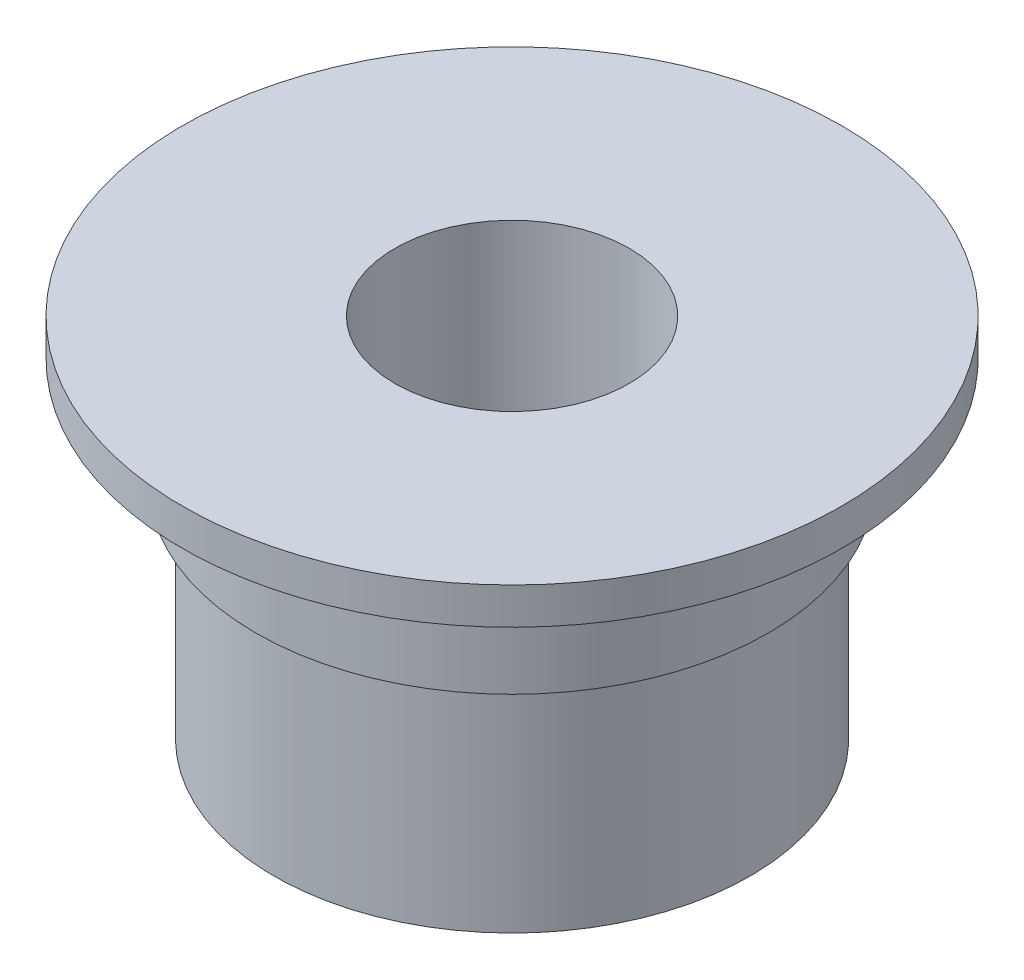
ISO-10303-21;
HEADER;
FILE_DESCRIPTION(('STEP AP214'),'2;1');
FILE_NAME('part.step','',(''),(''),'','','');
FILE_SCHEMA(('AUTOMOTIVE_DESIGN { 1 0 10303 214 1 1 1 1 }'));
ENDSEC;
DATA;
#1=APPLICATION_CONTEXT('core data for automotive mechanical design processes');
#2=APPLICATION_PROTOCOL_DEFINITION('international standard','automotive_design',2000,#1);
#3=PRODUCT_CONTEXT('',#1,'mechanical');
#4=PRODUCT('Part','Part','',(#3));
#5=PRODUCT_RELATED_PRODUCT_CATEGORY('part','',(#4));
#6=PRODUCT_DEFINITION_FORMATION('','',#4);
#7=PRODUCT_DEFINITION_CONTEXT('part definition',#1,'design');
#8=PRODUCT_DEFINITION('design','',#6,#7);
#9=PRODUCT_DEFINITION_SHAPE('','',#8);
#10=(LENGTH_UNIT() NAMED_UNIT(*) SI_UNIT(.MILLI.,.METRE.));
#11=(NAMED_UNIT(*) PLANE_ANGLE_UNIT() SI_UNIT($,.RADIAN.));
#12=(NAMED_UNIT(*) SI_UNIT($,.STERADIAN.) SOLID_ANGLE_UNIT());
#13=UNCERTAINTY_MEASURE_WITH_UNIT(LENGTH_MEASURE(1.E-05),#10,'distance_accuracy_value','');
#14=(GEOMETRIC_REPRESENTATION_CONTEXT(3) GLOBAL_UNCERTAINTY_ASSIGNED_CONTEXT((#13)) GLOBAL_UNIT_ASSIGNED_CONTEXT((#10,
#11,#12)) REPRESENTATION_CONTEXT('',''));
#15=CARTESIAN_POINT('',(0.,0.,0.));
#16=DIRECTION('',(0.,0.,1.));
#17=DIRECTION('',(1.,0.,0.));
#18=AXIS2_PLACEMENT_3D('',#15,#16,#17);
#19=CARTESIAN_POINT('',(0.,0.,0.));
#20=DIRECTION('',(0.,-1.,0.));
#21=DIRECTION('',(0.,0.,-1.));
#22=AXIS2_PLACEMENT_3D('',#19,#20,#21);
#23=CYLINDRICAL_SURFACE('',#22,3.2);
#24=CARTESIAN_POINT('',(0.,0.,0.));
#25=DIRECTION('',(0.,-1.,0.));
#26=DIRECTION('',(0.,0.,-1.));
#27=AXIS2_PLACEMENT_3D('',#24,#25,#26);
#28=CIRCLE('',#27,3.2);
#29=CARTESIAN_POINT('',(0.,0.,-3.2));
#30=VERTEX_POINT('',#29);
#31=EDGE_CURVE('E10',#30,#30,#28,.T.);
#32=ORIENTED_EDGE('',*,*,#31,.T.);
#33=EDGE_LOOP('',(#32));
#34=FACE_BOUND('',#33,.T.);
#35=CARTESIAN_POINT('',(0.,10.,0.));
#36=DIRECTION('',(0.,-1.,0.));
#37=DIRECTION('',(0.,0.,-1.));
#38=AXIS2_PLACEMENT_3D('',#35,#36,#37);
#39=CIRCLE('',#38,3.2);
#40=CARTESIAN_POINT('',(0.,10.,-3.2));
#41=VERTEX_POINT('',#40);
#42=EDGE_CURVE('E65',#41,#41,#39,.T.);
#43=ORIENTED_EDGE('',*,*,#42,.F.);
#44=EDGE_LOOP('',(#43));
#45=FACE_BOUND('',#44,.T.);
#46=ADVANCED_FACE('F37',(#34,#45),#23,.F.);
#47=CARTESIAN_POINT('',(3.2,0.,0.));
#48=DIRECTION('',(0.,-1.,0.));
#49=DIRECTION('',(0.,0.,-1.));
#50=AXIS2_PLACEMENT_3D('',#47,#48,#49);
#51=PLANE('',#50);
#52=CARTESIAN_POINT('',(0.,0.,0.));
#53=DIRECTION('',(0.,-1.,0.));
#54=DIRECTION('',(0.,0.,-1.));
#55=AXIS2_PLACEMENT_3D('',#52,#53,#54);
#56=CIRCLE('',#55,6.5);
#57=CARTESIAN_POINT('',(0.,0.,-6.5));
#58=VERTEX_POINT('',#57);
#59=EDGE_CURVE('E43',#58,#58,#56,.T.);
#60=ORIENTED_EDGE('',*,*,#59,.T.);
#61=EDGE_LOOP('',(#60));
#62=FACE_BOUND('',#61,.T.);
#63=ORIENTED_EDGE('',*,*,#31,.F.);
#64=EDGE_LOOP('',(#63));
#65=FACE_BOUND('',#64,.T.);
#66=ADVANCED_FACE('F73',(#62,#65),#51,.T.);
#67=CARTESIAN_POINT('',(0.,0.,0.));
#68=DIRECTION('',(0.,-1.,0.));
#69=DIRECTION('',(0.,0.,-1.));
#70=AXIS2_PLACEMENT_3D('',#67,#68,#69);
#71=CYLINDRICAL_SURFACE('',#70,6.5);
#72=CARTESIAN_POINT('',(0.,6.,0.));
#73=DIRECTION('',(0.,-1.,0.));
#74=DIRECTION('',(0.,0.,-1.));
#75=AXIS2_PLACEMENT_3D('',#72,#73,#74);
#76=CIRCLE('',#75,6.5);
#77=CARTESIAN_POINT('',(0.,6.,-6.5));
#78=VERTEX_POINT('',#77);
#79=EDGE_CURVE('E47',#78,#78,#76,.T.);
#80=ORIENTED_EDGE('',*,*,#79,.T.);
#81=EDGE_LOOP('',(#80));
#82=FACE_BOUND('',#81,.T.);
#83=ORIENTED_EDGE('',*,*,#59,.F.);
#84=EDGE_LOOP('',(#83));
#85=FACE_BOUND('',#84,.T.);
#86=ADVANCED_FACE('F77',(#82,#85),#71,.T.);
#87=CARTESIAN_POINT('',(6.5,6.,0.));
#88=DIRECTION('',(0.,-1.,0.));
#89=DIRECTION('',(0.,0.,-1.));
#90=AXIS2_PLACEMENT_3D('',#87,#88,#89);
#91=PLANE('',#90);
#92=CARTESIAN_POINT('',(0.,6.,0.));
#93=DIRECTION('',(0.,-1.,0.));
#94=DIRECTION('',(0.,0.,-1.));
#95=AXIS2_PLACEMENT_3D('',#92,#93,#94);
#96=CIRCLE('',#95,7.);
#97=CARTESIAN_POINT('',(0.,6.,-7.));
#98=VERTEX_POINT('',#97);
#99=EDGE_CURVE('E51',#98,#98,#96,.T.);
#100=ORIENTED_EDGE('',*,*,#99,.T.);
#101=EDGE_LOOP('',(#100));
#102=FACE_BOUND('',#101,.T.);
#103=ORIENTED_EDGE('',*,*,#79,.F.);
#104=EDGE_LOOP('',(#103));
#105=FACE_BOUND('',#104,.T.);
#106=ADVANCED_FACE('F81',(#102,#105),#91,.T.);
#107=CARTESIAN_POINT('',(0.,0.,0.));
#108=DIRECTION('',(0.,-1.,0.));
#109=DIRECTION('',(0.,0.,-1.));
#110=AXIS2_PLACEMENT_3D('',#107,#108,#109);
#111=CYLINDRICAL_SURFACE('',#110,7.);
#112=CARTESIAN_POINT('',(0.,9.,0.));
#113=DIRECTION('',(0.,-1.,0.));
#114=DIRECTION('',(0.,0.,-1.));
#115=AXIS2_PLACEMENT_3D('',#112,#113,#114);
#116=CIRCLE('',#115,7.);
#117=CARTESIAN_POINT('',(0.,9.,-7.));
#118=VERTEX_POINT('',#117);
#119=EDGE_CURVE('E56',#118,#118,#116,.T.);
#120=ORIENTED_EDGE('',*,*,#119,.T.);
#121=EDGE_LOOP('',(#120));
#122=FACE_BOUND('',#121,.T.);
#123=ORIENTED_EDGE('',*,*,#99,.F.);
#124=EDGE_LOOP('',(#123));
#125=FACE_BOUND('',#124,.T.);
#126=ADVANCED_FACE('F88',(#122,#125),#111,.T.);
#127=CARTESIAN_POINT('',(7.,9.,0.));
#128=DIRECTION('',(0.,-1.,0.));
#129=DIRECTION('',(0.,0.,-1.));
#130=AXIS2_PLACEMENT_3D('',#127,#128,#129);
#131=PLANE('',#130);
#132=CARTESIAN_POINT('',(0.,9.,0.));
#133=DIRECTION('',(0.,-1.,0.));
#134=DIRECTION('',(0.,0.,-1.));
#135=AXIS2_PLACEMENT_3D('',#132,#133,#134);
#136=CIRCLE('',#135,9.);
#137=CARTESIAN_POINT('',(0.,9.,-9.));
#138=VERTEX_POINT('',#137);
#139=EDGE_CURVE('E59',#138,#138,#136,.T.);
#140=ORIENTED_EDGE('',*,*,#139,.T.);
#141=EDGE_LOOP('',(#140));
#142=FACE_BOUND('',#141,.T.);
#143=ORIENTED_EDGE('',*,*,#119,.F.);
#144=EDGE_LOOP('',(#143));
#145=FACE_BOUND('',#144,.T.);
#146=ADVANCED_FACE('F92',(#142,#145),#131,.T.);
#147=CARTESIAN_POINT('',(0.,0.,0.));
#148=DIRECTION('',(0.,-1.,0.));
#149=DIRECTION('',(0.,0.,-1.));
#150=AXIS2_PLACEMENT_3D('',#147,#148,#149);
#151=CYLINDRICAL_SURFACE('',#150,9.);
#152=CARTESIAN_POINT('',(0.,10.,0.));
#153=DIRECTION('',(0.,-1.,0.));
#154=DIRECTION('',(0.,0.,-1.));
#155=AXIS2_PLACEMENT_3D('',#152,#153,#154);
#156=CIRCLE('',#155,9.);
#157=CARTESIAN_POINT('',(0.,10.,-9.));
#158=VERTEX_POINT('',#157);
#159=EDGE_CURVE('E62',#158,#158,#156,.T.);
#160=ORIENTED_EDGE('',*,*,#159,.T.);
#161=EDGE_LOOP('',(#160));
#162=FACE_BOUND('',#161,.T.);
#163=ORIENTED_EDGE('',*,*,#139,.F.);
#164=EDGE_LOOP('',(#163));
#165=FACE_BOUND('',#164,.T.);
#166=ADVANCED_FACE('F96',(#162,#165),#151,.T.);
#167=CARTESIAN_POINT('',(9.,10.,0.));
#168=DIRECTION('',(0.,1.,0.));
#169=DIRECTION('',(0.,0.,1.));
#170=AXIS2_PLACEMENT_3D('',#167,#168,#169);
#171=PLANE('',#170);
#172=ORIENTED_EDGE('',*,*,#42,.T.);
#173=EDGE_LOOP('',(#172));
#174=FACE_BOUND('',#173,.T.);
#175=ORIENTED_EDGE('',*,*,#159,.F.);
#176=EDGE_LOOP('',(#175));
#177=FACE_BOUND('',#176,.T.);
#178=ADVANCED_FACE('F69',(#174,#177),#171,.T.);
#179=CLOSED_SHELL('',(#46,#66,#86,#106,#126,#146,#166,#178));
#180=MANIFOLD_SOLID_BREP('B2',#179);
#181=ADVANCED_BREP_SHAPE_REPRESENTATION('',(#18,#180),#14);
#182=SHAPE_DEFINITION_REPRESENTATION(#9,#181);
ENDSEC;
END-ISO-10303-21;
